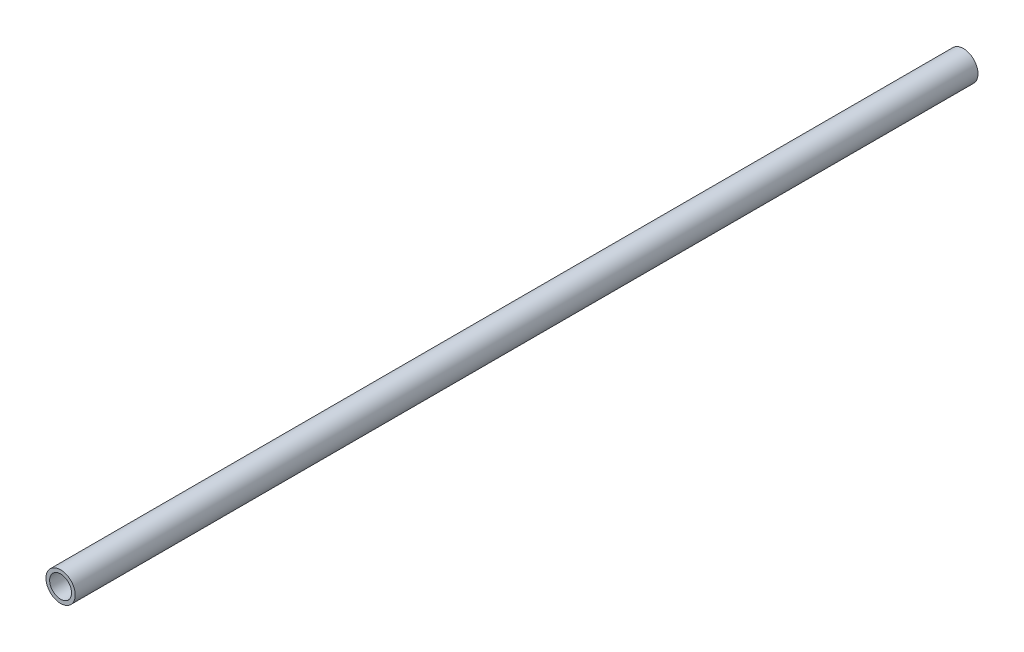
ISO-10303-21;
HEADER;
FILE_DESCRIPTION(('STEP AP214'),'2;1');
FILE_NAME('part.step','',(''),(''),'','','');
FILE_SCHEMA(('AUTOMOTIVE_DESIGN { 1 0 10303 214 1 1 1 1 }'));
ENDSEC;
DATA;
#1=APPLICATION_CONTEXT('core data for automotive mechanical design processes');
#2=APPLICATION_PROTOCOL_DEFINITION('international standard','automotive_design',2000,#1);
#3=PRODUCT_CONTEXT('',#1,'mechanical');
#4=PRODUCT('Part','Part','',(#3));
#5=PRODUCT_RELATED_PRODUCT_CATEGORY('part','',(#4));
#6=PRODUCT_DEFINITION_FORMATION('','',#4);
#7=PRODUCT_DEFINITION_CONTEXT('part definition',#1,'design');
#8=PRODUCT_DEFINITION('design','',#6,#7);
#9=PRODUCT_DEFINITION_SHAPE('','',#8);
#10=(LENGTH_UNIT() NAMED_UNIT(*) SI_UNIT(.MILLI.,.METRE.));
#11=(NAMED_UNIT(*) PLANE_ANGLE_UNIT() SI_UNIT($,.RADIAN.));
#12=(NAMED_UNIT(*) SI_UNIT($,.STERADIAN.) SOLID_ANGLE_UNIT());
#13=UNCERTAINTY_MEASURE_WITH_UNIT(LENGTH_MEASURE(1.E-05),#10,'distance_accuracy_value','');
#14=(GEOMETRIC_REPRESENTATION_CONTEXT(3) GLOBAL_UNCERTAINTY_ASSIGNED_CONTEXT((#13)) GLOBAL_UNIT_ASSIGNED_CONTEXT((#10,
#11,#12)) REPRESENTATION_CONTEXT('',''));
#15=CARTESIAN_POINT('',(0.,0.,0.));
#16=DIRECTION('',(0.,0.,1.));
#17=DIRECTION('',(1.,0.,0.));
#18=AXIS2_PLACEMENT_3D('',#15,#16,#17);
#19=CARTESIAN_POINT('',(21.1445115660738,12.4911384446965,247.));
#20=DIRECTION('',(0.,0.,1.));
#21=DIRECTION('',(1.,0.,0.));
#22=AXIS2_PLACEMENT_3D('',#19,#20,#21);
#23=PLANE('',#22);
#24=CARTESIAN_POINT('',(21.1445115660738,12.4911384446965,247.));
#25=DIRECTION('',(0.,0.,1.));
#26=DIRECTION('',(1.,0.,0.));
#27=AXIS2_PLACEMENT_3D('',#24,#25,#26);
#28=CIRCLE('',#27,4.);
#29=CARTESIAN_POINT('',(25.1445115660738,12.4911384446965,247.));
#30=VERTEX_POINT('',#29);
#31=EDGE_CURVE('E10',#30,#30,#28,.T.);
#32=ORIENTED_EDGE('',*,*,#31,.T.);
#33=EDGE_LOOP('',(#32));
#34=FACE_BOUND('',#33,.T.);
#35=CARTESIAN_POINT('',(21.1445115660738,12.4911384446965,247.));
#36=DIRECTION('',(0.,0.,1.));
#37=DIRECTION('',(1.,0.,0.));
#38=AXIS2_PLACEMENT_3D('',#35,#36,#37);
#39=CIRCLE('',#38,3.);
#40=CARTESIAN_POINT('',(24.1445115660738,12.4911384446965,247.));
#41=VERTEX_POINT('',#40);
#42=EDGE_CURVE('E42',#41,#41,#39,.T.);
#43=ORIENTED_EDGE('',*,*,#42,.F.);
#44=EDGE_LOOP('',(#43));
#45=FACE_BOUND('',#44,.T.);
#46=ADVANCED_FACE('F31',(#34,#45),#23,.T.);
#47=CARTESIAN_POINT('',(21.1445115660738,12.4911384446965,0.));
#48=DIRECTION('',(0.,0.,1.));
#49=DIRECTION('',(1.,0.,0.));
#50=AXIS2_PLACEMENT_3D('',#47,#48,#49);
#51=PLANE('',#50);
#52=CARTESIAN_POINT('',(21.1445115660738,12.4911384446965,0.));
#53=DIRECTION('',(0.,0.,1.));
#54=DIRECTION('',(1.,0.,0.));
#55=AXIS2_PLACEMENT_3D('',#52,#53,#54);
#56=CIRCLE('',#55,4.);
#57=CARTESIAN_POINT('',(25.1445115660738,12.4911384446965,0.));
#58=VERTEX_POINT('',#57);
#59=EDGE_CURVE('E35',#58,#58,#56,.T.);
#60=ORIENTED_EDGE('',*,*,#59,.F.);
#61=EDGE_LOOP('',(#60));
#62=FACE_BOUND('',#61,.T.);
#63=CARTESIAN_POINT('',(21.1445115660738,12.4911384446965,0.));
#64=DIRECTION('',(0.,0.,1.));
#65=DIRECTION('',(1.,0.,0.));
#66=AXIS2_PLACEMENT_3D('',#63,#64,#65);
#67=CIRCLE('',#66,3.);
#68=CARTESIAN_POINT('',(24.1445115660738,12.4911384446965,0.));
#69=VERTEX_POINT('',#68);
#70=EDGE_CURVE('E44',#69,#69,#67,.T.);
#71=ORIENTED_EDGE('',*,*,#70,.T.);
#72=EDGE_LOOP('',(#71));
#73=FACE_BOUND('',#72,.T.);
#74=ADVANCED_FACE('F54',(#62,#73),#51,.F.);
#75=CARTESIAN_POINT('',(21.1445115660738,12.4911384446965,247.));
#76=DIRECTION('',(0.,0.,-1.));
#77=DIRECTION('',(-1.,0.,0.));
#78=AXIS2_PLACEMENT_3D('',#75,#76,#77);
#79=CYLINDRICAL_SURFACE('',#78,4.);
#80=ORIENTED_EDGE('',*,*,#31,.F.);
#81=EDGE_LOOP('',(#80));
#82=FACE_BOUND('',#81,.T.);
#83=ORIENTED_EDGE('',*,*,#59,.T.);
#84=EDGE_LOOP('',(#83));
#85=FACE_BOUND('',#84,.T.);
#86=ADVANCED_FACE('F33',(#82,#85),#79,.T.);
#87=CARTESIAN_POINT('',(21.1445115660738,12.4911384446965,247.));
#88=DIRECTION('',(0.,0.,-1.));
#89=DIRECTION('',(-1.,0.,0.));
#90=AXIS2_PLACEMENT_3D('',#87,#88,#89);
#91=CYLINDRICAL_SURFACE('',#90,3.);
#92=ORIENTED_EDGE('',*,*,#42,.T.);
#93=EDGE_LOOP('',(#92));
#94=FACE_BOUND('',#93,.T.);
#95=ORIENTED_EDGE('',*,*,#70,.F.);
#96=EDGE_LOOP('',(#95));
#97=FACE_BOUND('',#96,.T.);
#98=ADVANCED_FACE('F50',(#94,#97),#91,.F.);
#99=CLOSED_SHELL('',(#46,#74,#86,#98));
#100=MANIFOLD_SOLID_BREP('B2',#99);
#101=ADVANCED_BREP_SHAPE_REPRESENTATION('',(#18,#100),#14);
#102=SHAPE_DEFINITION_REPRESENTATION(#9,#101);
ENDSEC;
END-ISO-10303-21;
